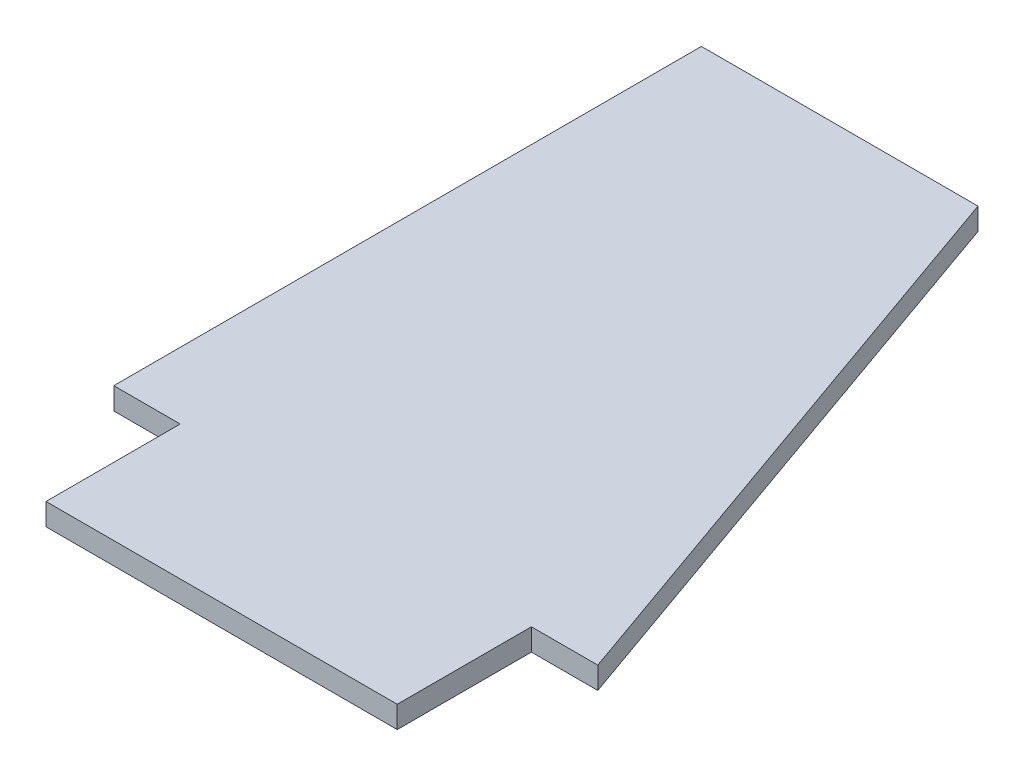
ISO-10303-21;
HEADER;
FILE_DESCRIPTION(('STEP AP214'),'2;1');
FILE_NAME('part.step','',(''),(''),'','','');
FILE_SCHEMA(('AUTOMOTIVE_DESIGN { 1 0 10303 214 1 1 1 1 }'));
ENDSEC;
DATA;
#1=APPLICATION_CONTEXT('core data for automotive mechanical design processes');
#2=APPLICATION_PROTOCOL_DEFINITION('international standard','automotive_design',2000,#1);
#3=PRODUCT_CONTEXT('',#1,'mechanical');
#4=PRODUCT('Part','Part','',(#3));
#5=PRODUCT_RELATED_PRODUCT_CATEGORY('part','',(#4));
#6=PRODUCT_DEFINITION_FORMATION('','',#4);
#7=PRODUCT_DEFINITION_CONTEXT('part definition',#1,'design');
#8=PRODUCT_DEFINITION('design','',#6,#7);
#9=PRODUCT_DEFINITION_SHAPE('','',#8);
#10=(LENGTH_UNIT() NAMED_UNIT(*) SI_UNIT(.MILLI.,.METRE.));
#11=(NAMED_UNIT(*) PLANE_ANGLE_UNIT() SI_UNIT($,.RADIAN.));
#12=(NAMED_UNIT(*) SI_UNIT($,.STERADIAN.) SOLID_ANGLE_UNIT());
#13=UNCERTAINTY_MEASURE_WITH_UNIT(LENGTH_MEASURE(1.E-05),#10,'distance_accuracy_value','');
#14=(GEOMETRIC_REPRESENTATION_CONTEXT(3) GLOBAL_UNCERTAINTY_ASSIGNED_CONTEXT((#13)) GLOBAL_UNIT_ASSIGNED_CONTEXT((#10,
#11,#12)) REPRESENTATION_CONTEXT('',''));
#15=CARTESIAN_POINT('',(0.,0.,0.));
#16=DIRECTION('',(0.,0.,1.));
#17=DIRECTION('',(1.,0.,0.));
#18=AXIS2_PLACEMENT_3D('',#15,#16,#17);
#19=CARTESIAN_POINT('',(60.4012,3.175,0.));
#20=DIRECTION('',(1.,0.,0.));
#21=DIRECTION('',(0.,0.,-1.));
#22=AXIS2_PLACEMENT_3D('',#19,#20,#21);
#23=PLANE('',#22);
#24=DIRECTION('',(0.,0.,1.));
#25=VECTOR('',#24,1.);
#26=CARTESIAN_POINT('',(60.4012,0.,0.));
#27=LINE('',#26,#25);
#28=CARTESIAN_POINT('',(60.4012,0.,0.));
#29=VERTEX_POINT('',#28);
#30=CARTESIAN_POINT('',(60.4012,0.,19.4056));
#31=VERTEX_POINT('',#30);
#32=EDGE_CURVE('E169',#29,#31,#27,.T.);
#33=ORIENTED_EDGE('',*,*,#32,.F.);
#34=DIRECTION('',(0.,-1.,0.));
#35=VECTOR('',#34,1.);
#36=CARTESIAN_POINT('',(60.4012,3.175,0.));
#37=LINE('',#36,#35);
#38=CARTESIAN_POINT('',(60.4012,3.175,0.));
#39=VERTEX_POINT('',#38);
#40=EDGE_CURVE('E11',#39,#29,#37,.T.);
#41=ORIENTED_EDGE('',*,*,#40,.F.);
#42=DIRECTION('',(0.,0.,1.));
#43=VECTOR('',#42,1.);
#44=CARTESIAN_POINT('',(60.4012,3.175,0.));
#45=LINE('',#44,#43);
#46=CARTESIAN_POINT('',(60.4012,3.175,19.4056));
#47=VERTEX_POINT('',#46);
#48=EDGE_CURVE('E139',#39,#47,#45,.T.);
#49=ORIENTED_EDGE('',*,*,#48,.T.);
#50=DIRECTION('',(0.,-1.,0.));
#51=VECTOR('',#50,1.);
#52=CARTESIAN_POINT('',(60.4012,3.175,19.4056));
#53=LINE('',#52,#51);
#54=EDGE_CURVE('E93',#47,#31,#53,.T.);
#55=ORIENTED_EDGE('',*,*,#54,.T.);
#56=EDGE_LOOP('',(#33,#41,#49,#55));
#57=FACE_BOUND('',#56,.T.);
#58=ADVANCED_FACE('F43',(#57),#23,.T.);
#59=CARTESIAN_POINT('',(0.,3.175,0.));
#60=DIRECTION('',(0.,0.,1.));
#61=DIRECTION('',(1.,0.,0.));
#62=AXIS2_PLACEMENT_3D('',#59,#60,#61);
#63=PLANE('',#62);
#64=DIRECTION('',(-1.,0.,0.));
#65=VECTOR('',#64,1.);
#66=CARTESIAN_POINT('',(0.,0.,0.));
#67=LINE('',#66,#65);
#68=CARTESIAN_POINT('',(70.0024,0.,0.));
#69=VERTEX_POINT('',#68);
#70=EDGE_CURVE('E166',#69,#29,#67,.T.);
#71=ORIENTED_EDGE('',*,*,#70,.F.);
#72=DIRECTION('',(0.,-1.,0.));
#73=VECTOR('',#72,1.);
#74=CARTESIAN_POINT('',(70.0024,3.175,0.));
#75=LINE('',#74,#73);
#76=CARTESIAN_POINT('',(70.0024,3.175,0.));
#77=VERTEX_POINT('',#76);
#78=EDGE_CURVE('E51',#77,#69,#75,.T.);
#79=ORIENTED_EDGE('',*,*,#78,.F.);
#80=DIRECTION('',(-1.,0.,0.));
#81=VECTOR('',#80,1.);
#82=CARTESIAN_POINT('',(0.,3.175,0.));
#83=LINE('',#82,#81);
#84=EDGE_CURVE('E132',#77,#39,#83,.T.);
#85=ORIENTED_EDGE('',*,*,#84,.T.);
#86=ORIENTED_EDGE('',*,*,#40,.T.);
#87=EDGE_LOOP('',(#71,#79,#85,#86));
#88=FACE_BOUND('',#87,.T.);
#89=ADVANCED_FACE('F167',(#88),#63,.T.);
#90=CARTESIAN_POINT('',(62.2476010812299,3.175,-21.9708358867102));
#91=DIRECTION('',(0.942985130551866,0.,-0.332834859289227));
#92=DIRECTION('',(-0.332834859289227,0.,-0.942985130551866));
#93=AXIS2_PLACEMENT_3D('',#90,#91,#92);
#94=PLANE('',#93);
#95=DIRECTION('',(0.332834859289227,0.,0.942985130551866));
#96=VECTOR('',#95,1.);
#97=CARTESIAN_POINT('',(62.2476010812299,0.,-21.9708358867102));
#98=LINE('',#97,#96);
#99=CARTESIAN_POINT('',(40.005,0.,-84.9884));
#100=VERTEX_POINT('',#99);
#101=EDGE_CURVE('E162',#100,#69,#98,.T.);
#102=ORIENTED_EDGE('',*,*,#101,.F.);
#103=DIRECTION('',(0.,-1.,0.));
#104=VECTOR('',#103,1.);
#105=CARTESIAN_POINT('',(40.005,3.175,-84.9884));
#106=LINE('',#105,#104);
#107=CARTESIAN_POINT('',(40.005,3.175,-84.9884));
#108=VERTEX_POINT('',#107);
#109=EDGE_CURVE('E156',#108,#100,#106,.T.);
#110=ORIENTED_EDGE('',*,*,#109,.F.);
#111=DIRECTION('',(0.332834859289227,0.,0.942985130551866));
#112=VECTOR('',#111,1.);
#113=CARTESIAN_POINT('',(62.2476010812299,3.175,-21.9708358867102));
#114=LINE('',#113,#112);
#115=EDGE_CURVE('E138',#108,#77,#114,.T.);
#116=ORIENTED_EDGE('',*,*,#115,.T.);
#117=ORIENTED_EDGE('',*,*,#78,.T.);
#118=EDGE_LOOP('',(#102,#110,#116,#117));
#119=FACE_BOUND('',#118,.T.);
#120=ADVANCED_FACE('F160',(#119),#94,.T.);
#121=CARTESIAN_POINT('',(0.,3.175,-84.9884));
#122=DIRECTION('',(0.,0.,-1.));
#123=DIRECTION('',(-1.,0.,0.));
#124=AXIS2_PLACEMENT_3D('',#121,#122,#123);
#125=PLANE('',#124);
#126=DIRECTION('',(1.,0.,0.));
#127=VECTOR('',#126,1.);
#128=CARTESIAN_POINT('',(0.,0.,-84.9884));
#129=LINE('',#128,#127);
#130=CARTESIAN_POINT('',(0.,0.,-84.9884));
#131=VERTEX_POINT('',#130);
#132=EDGE_CURVE('E174',#131,#100,#129,.T.);
#133=ORIENTED_EDGE('',*,*,#132,.F.);
#134=DIRECTION('',(0.,-1.,0.));
#135=VECTOR('',#134,1.);
#136=CARTESIAN_POINT('',(0.,3.175,-84.9884));
#137=LINE('',#136,#135);
#138=CARTESIAN_POINT('',(0.,3.175,-84.9884));
#139=VERTEX_POINT('',#138);
#140=EDGE_CURVE('E154',#139,#131,#137,.T.);
#141=ORIENTED_EDGE('',*,*,#140,.F.);
#142=DIRECTION('',(1.,0.,0.));
#143=VECTOR('',#142,1.);
#144=CARTESIAN_POINT('',(0.,3.175,-84.9884));
#145=LINE('',#144,#143);
#146=EDGE_CURVE('E133',#139,#108,#145,.T.);
#147=ORIENTED_EDGE('',*,*,#146,.T.);
#148=ORIENTED_EDGE('',*,*,#109,.T.);
#149=EDGE_LOOP('',(#133,#141,#147,#148));
#150=FACE_BOUND('',#149,.T.);
#151=ADVANCED_FACE('F184',(#150),#125,.T.);
#152=CARTESIAN_POINT('',(0.,3.175,0.));
#153=DIRECTION('',(-1.,0.,0.));
#154=DIRECTION('',(0.,0.,1.));
#155=AXIS2_PLACEMENT_3D('',#152,#153,#154);
#156=PLANE('',#155);
#157=DIRECTION('',(0.,0.,-1.));
#158=VECTOR('',#157,1.);
#159=CARTESIAN_POINT('',(0.,0.,0.));
#160=LINE('',#159,#158);
#161=CARTESIAN_POINT('',(0.,0.,0.));
#162=VERTEX_POINT('',#161);
#163=EDGE_CURVE('E176',#162,#131,#160,.T.);
#164=ORIENTED_EDGE('',*,*,#163,.F.);
#165=DIRECTION('',(0.,-1.,0.));
#166=VECTOR('',#165,1.);
#167=CARTESIAN_POINT('',(0.,3.175,0.));
#168=LINE('',#167,#166);
#169=CARTESIAN_POINT('',(0.,3.175,0.));
#170=VERTEX_POINT('',#169);
#171=EDGE_CURVE('E120',#170,#162,#168,.T.);
#172=ORIENTED_EDGE('',*,*,#171,.F.);
#173=DIRECTION('',(0.,0.,-1.));
#174=VECTOR('',#173,1.);
#175=CARTESIAN_POINT('',(0.,3.175,0.));
#176=LINE('',#175,#174);
#177=EDGE_CURVE('E130',#170,#139,#176,.T.);
#178=ORIENTED_EDGE('',*,*,#177,.T.);
#179=ORIENTED_EDGE('',*,*,#140,.T.);
#180=EDGE_LOOP('',(#164,#172,#178,#179));
#181=FACE_BOUND('',#180,.T.);
#182=ADVANCED_FACE('F186',(#181),#156,.T.);
#183=CARTESIAN_POINT('',(9.6012,0.,0.));
#184=VERTEX_POINT('',#183);
#185=EDGE_CURVE('E119',#184,#162,#67,.T.);
#186=ORIENTED_EDGE('',*,*,#185,.F.);
#187=DIRECTION('',(0.,-1.,0.));
#188=VECTOR('',#187,1.);
#189=CARTESIAN_POINT('',(9.6012,3.175,0.));
#190=LINE('',#189,#188);
#191=CARTESIAN_POINT('',(9.6012,3.175,0.));
#192=VERTEX_POINT('',#191);
#193=EDGE_CURVE('E113',#192,#184,#190,.T.);
#194=ORIENTED_EDGE('',*,*,#193,.F.);
#195=EDGE_CURVE('E117',#192,#170,#83,.T.);
#196=ORIENTED_EDGE('',*,*,#195,.T.);
#197=ORIENTED_EDGE('',*,*,#171,.T.);
#198=EDGE_LOOP('',(#186,#194,#196,#197));
#199=FACE_BOUND('',#198,.T.);
#200=ADVANCED_FACE('F115',(#199),#63,.T.);
#201=CARTESIAN_POINT('',(9.6012,3.175,0.));
#202=DIRECTION('',(1.,0.,0.));
#203=DIRECTION('',(0.,0.,-1.));
#204=AXIS2_PLACEMENT_3D('',#201,#202,#203);
#205=PLANE('',#204);
#206=DIRECTION('',(0.,0.,1.));
#207=VECTOR('',#206,1.);
#208=CARTESIAN_POINT('',(9.6012,0.,0.));
#209=LINE('',#208,#207);
#210=CARTESIAN_POINT('',(9.6012,0.,19.4056));
#211=VERTEX_POINT('',#210);
#212=EDGE_CURVE('E86',#184,#211,#209,.T.);
#213=ORIENTED_EDGE('',*,*,#212,.T.);
#214=DIRECTION('',(0.,-1.,0.));
#215=VECTOR('',#214,1.);
#216=CARTESIAN_POINT('',(9.6012,3.175,19.4056));
#217=LINE('',#216,#215);
#218=CARTESIAN_POINT('',(9.6012,3.175,19.4056));
#219=VERTEX_POINT('',#218);
#220=EDGE_CURVE('E121',#219,#211,#217,.T.);
#221=ORIENTED_EDGE('',*,*,#220,.F.);
#222=DIRECTION('',(0.,0.,1.));
#223=VECTOR('',#222,1.);
#224=CARTESIAN_POINT('',(9.6012,3.175,0.));
#225=LINE('',#224,#223);
#226=EDGE_CURVE('E123',#192,#219,#225,.T.);
#227=ORIENTED_EDGE('',*,*,#226,.F.);
#228=ORIENTED_EDGE('',*,*,#193,.T.);
#229=EDGE_LOOP('',(#213,#221,#227,#228));
#230=FACE_BOUND('',#229,.T.);
#231=ADVANCED_FACE('F124',(#230),#205,.F.);
#232=CARTESIAN_POINT('',(0.,3.175,19.4056));
#233=DIRECTION('',(0.,0.,-1.));
#234=DIRECTION('',(-1.,0.,0.));
#235=AXIS2_PLACEMENT_3D('',#232,#233,#234);
#236=PLANE('',#235);
#237=DIRECTION('',(1.,0.,0.));
#238=VECTOR('',#237,1.);
#239=CARTESIAN_POINT('',(0.,0.,19.4056));
#240=LINE('',#239,#238);
#241=EDGE_CURVE('E143',#211,#31,#240,.T.);
#242=ORIENTED_EDGE('',*,*,#241,.T.);
#243=ORIENTED_EDGE('',*,*,#54,.F.);
#244=DIRECTION('',(1.,0.,0.));
#245=VECTOR('',#244,1.);
#246=CARTESIAN_POINT('',(0.,3.175,19.4056));
#247=LINE('',#246,#245);
#248=EDGE_CURVE('E59',#219,#47,#247,.T.);
#249=ORIENTED_EDGE('',*,*,#248,.F.);
#250=ORIENTED_EDGE('',*,*,#220,.T.);
#251=EDGE_LOOP('',(#242,#243,#249,#250));
#252=FACE_BOUND('',#251,.T.);
#253=ADVANCED_FACE('F205',(#252),#236,.F.);
#254=CARTESIAN_POINT('',(0.,3.175,0.));
#255=DIRECTION('',(0.,1.,0.));
#256=DIRECTION('',(0.,0.,1.));
#257=AXIS2_PLACEMENT_3D('',#254,#255,#256);
#258=PLANE('',#257);
#259=ORIENTED_EDGE('',*,*,#48,.F.);
#260=ORIENTED_EDGE('',*,*,#84,.F.);
#261=ORIENTED_EDGE('',*,*,#115,.F.);
#262=ORIENTED_EDGE('',*,*,#146,.F.);
#263=ORIENTED_EDGE('',*,*,#177,.F.);
#264=ORIENTED_EDGE('',*,*,#195,.F.);
#265=ORIENTED_EDGE('',*,*,#226,.T.);
#266=ORIENTED_EDGE('',*,*,#248,.T.);
#267=EDGE_LOOP('',(#259,#260,#261,#262,#263,#264,#265,#266));
#268=FACE_BOUND('',#267,.T.);
#269=ADVANCED_FACE('F127',(#268),#258,.T.);
#270=CARTESIAN_POINT('',(0.,0.,0.));
#271=DIRECTION('',(0.,1.,0.));
#272=DIRECTION('',(0.,0.,1.));
#273=AXIS2_PLACEMENT_3D('',#270,#271,#272);
#274=PLANE('',#273);
#275=ORIENTED_EDGE('',*,*,#32,.T.);
#276=ORIENTED_EDGE('',*,*,#241,.F.);
#277=ORIENTED_EDGE('',*,*,#212,.F.);
#278=ORIENTED_EDGE('',*,*,#185,.T.);
#279=ORIENTED_EDGE('',*,*,#163,.T.);
#280=ORIENTED_EDGE('',*,*,#132,.T.);
#281=ORIENTED_EDGE('',*,*,#101,.T.);
#282=ORIENTED_EDGE('',*,*,#70,.T.);
#283=EDGE_LOOP('',(#275,#276,#277,#278,#279,#280,#281,#282));
#284=FACE_BOUND('',#283,.T.);
#285=ADVANCED_FACE('F171',(#284),#274,.F.);
#286=CLOSED_SHELL('',(#58,#89,#120,#151,#182,#200,#231,#253,#269,#285));
#287=MANIFOLD_SOLID_BREP('B2',#286);
#288=ADVANCED_BREP_SHAPE_REPRESENTATION('',(#18,#287),#14);
#289=SHAPE_DEFINITION_REPRESENTATION(#9,#288);
ENDSEC;
END-ISO-10303-21;
